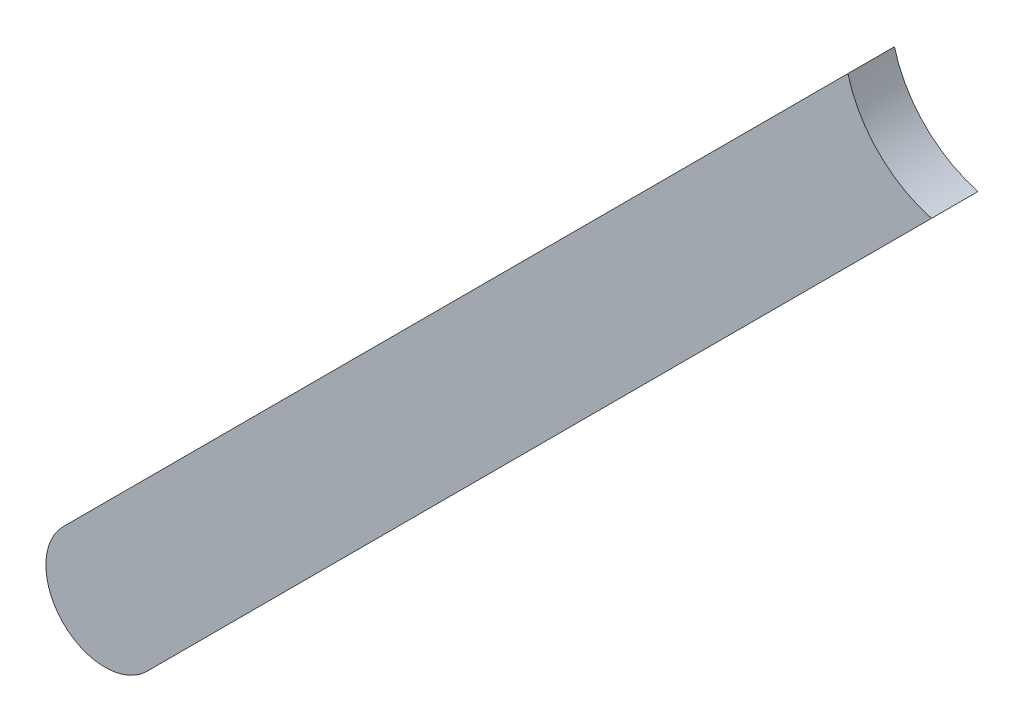
ISO-10303-21;
HEADER;
FILE_DESCRIPTION(('STEP AP214'),'2;1');
FILE_NAME('part.step','',(''),(''),'','','');
FILE_SCHEMA(('AUTOMOTIVE_DESIGN { 1 0 10303 214 1 1 1 1 }'));
ENDSEC;
DATA;
#1=APPLICATION_CONTEXT('core data for automotive mechanical design processes');
#2=APPLICATION_PROTOCOL_DEFINITION('international standard','automotive_design',2000,#1);
#3=PRODUCT_CONTEXT('',#1,'mechanical');
#4=PRODUCT('Part','Part','',(#3));
#5=PRODUCT_RELATED_PRODUCT_CATEGORY('part','',(#4));
#6=PRODUCT_DEFINITION_FORMATION('','',#4);
#7=PRODUCT_DEFINITION_CONTEXT('part definition',#1,'design');
#8=PRODUCT_DEFINITION('design','',#6,#7);
#9=PRODUCT_DEFINITION_SHAPE('','',#8);
#10=(LENGTH_UNIT() NAMED_UNIT(*) SI_UNIT(.MILLI.,.METRE.));
#11=(NAMED_UNIT(*) PLANE_ANGLE_UNIT() SI_UNIT($,.RADIAN.));
#12=(NAMED_UNIT(*) SI_UNIT($,.STERADIAN.) SOLID_ANGLE_UNIT());
#13=UNCERTAINTY_MEASURE_WITH_UNIT(LENGTH_MEASURE(1.E-05),#10,'distance_accuracy_value','');
#14=(GEOMETRIC_REPRESENTATION_CONTEXT(3) GLOBAL_UNCERTAINTY_ASSIGNED_CONTEXT((#13)) GLOBAL_UNIT_ASSIGNED_CONTEXT((#10,
#11,#12)) REPRESENTATION_CONTEXT('',''));
#15=CARTESIAN_POINT('',(0.,0.,0.));
#16=DIRECTION('',(0.,0.,1.));
#17=DIRECTION('',(1.,0.,0.));
#18=AXIS2_PLACEMENT_3D('',#15,#16,#17);
#19=CARTESIAN_POINT('',(86.66660594,90.37139406,0.));
#20=DIRECTION('',(-0.707106781186548,0.707106781186548,0.));
#21=DIRECTION('',(0.707106781186548,0.707106781186548,0.));
#22=AXIS2_PLACEMENT_3D('',#19,#20,#21);
#23=PLANE('',#22);
#24=DIRECTION('',(0.707106781186548,0.707106781186548,0.));
#25=VECTOR('',#24,1.);
#26=CARTESIAN_POINT('',(86.66660594,90.37139406,0.1999996));
#27=LINE('',#26,#25);
#28=CARTESIAN_POINT('',(86.66660594,90.37139406,0.1999996));
#29=VERTEX_POINT('',#28);
#30=CARTESIAN_POINT('',(90.0385212146972,93.7433093346972,0.1999996));
#31=VERTEX_POINT('',#30);
#32=EDGE_CURVE('E11',#29,#31,#27,.T.);
#33=ORIENTED_EDGE('',*,*,#32,.F.);
#34=DIRECTION('',(0.,0.,1.));
#35=VECTOR('',#34,1.);
#36=CARTESIAN_POINT('',(86.66660594,90.37139406,0.));
#37=LINE('',#36,#35);
#38=CARTESIAN_POINT('',(86.66660594,90.37139406,0.));
#39=VERTEX_POINT('',#38);
#40=EDGE_CURVE('E24',#39,#29,#37,.T.);
#41=ORIENTED_EDGE('',*,*,#40,.F.);
#42=DIRECTION('',(0.707106781186548,0.707106781186548,0.));
#43=VECTOR('',#42,1.);
#44=CARTESIAN_POINT('',(86.66660594,90.37139406,0.));
#45=LINE('',#44,#43);
#46=CARTESIAN_POINT('',(90.0385212146972,93.7433093346972,0.));
#47=VERTEX_POINT('',#46);
#48=EDGE_CURVE('E75',#39,#47,#45,.T.);
#49=ORIENTED_EDGE('',*,*,#48,.T.);
#50=DIRECTION('',(0.,0.,1.));
#51=VECTOR('',#50,1.);
#52=CARTESIAN_POINT('',(90.0385212146972,93.7433093346972,0.));
#53=LINE('',#52,#51);
#54=EDGE_CURVE('E37',#47,#31,#53,.T.);
#55=ORIENTED_EDGE('',*,*,#54,.T.);
#56=EDGE_LOOP('',(#33,#41,#49,#55));
#57=FACE_BOUND('',#56,.T.);
#58=ADVANCED_FACE('F17',(#57),#23,.F.);
#59=CARTESIAN_POINT('',(90.17,94.234,0.));
#60=DIRECTION('',(0.,0.,-1.));
#61=DIRECTION('',(1.,0.,0.));
#62=AXIS2_PLACEMENT_3D('',#59,#60,#61);
#63=CYLINDRICAL_SURFACE('',#62,0.508);
#64=DIRECTION('',(0.,0.,1.));
#65=VECTOR('',#64,1.);
#66=CARTESIAN_POINT('',(89.6793093346972,94.1025212146972,0.));
#67=LINE('',#66,#65);
#68=CARTESIAN_POINT('',(89.6793093346972,94.1025212146972,0.));
#69=VERTEX_POINT('',#68);
#70=CARTESIAN_POINT('',(89.6793093346972,94.1025212146972,0.1999996));
#71=VERTEX_POINT('',#70);
#72=EDGE_CURVE('E67',#69,#71,#67,.T.);
#73=ORIENTED_EDGE('',*,*,#72,.T.);
#74=CARTESIAN_POINT('',(90.17,94.234,0.1999996));
#75=DIRECTION('',(0.,0.,1.));
#76=DIRECTION('',(1.,0.,0.));
#77=AXIS2_PLACEMENT_3D('',#74,#75,#76);
#78=CIRCLE('',#77,0.508);
#79=EDGE_CURVE('E82',#71,#31,#78,.T.);
#80=ORIENTED_EDGE('',*,*,#79,.T.);
#81=ORIENTED_EDGE('',*,*,#54,.F.);
#82=CARTESIAN_POINT('',(90.17,94.234,0.));
#83=DIRECTION('',(0.,0.,1.));
#84=DIRECTION('',(1.,0.,0.));
#85=AXIS2_PLACEMENT_3D('',#82,#83,#84);
#86=CIRCLE('',#85,0.508);
#87=EDGE_CURVE('E80',#69,#47,#86,.T.);
#88=ORIENTED_EDGE('',*,*,#87,.F.);
#89=EDGE_LOOP('',(#73,#80,#81,#88));
#90=FACE_BOUND('',#89,.T.);
#91=ADVANCED_FACE('F88',(#90),#63,.F.);
#92=CARTESIAN_POINT('',(89.6793093346972,94.1025212146972,0.));
#93=DIRECTION('',(0.707106781186548,-0.707106781186548,0.));
#94=DIRECTION('',(-0.707106781186548,-0.707106781186548,0.));
#95=AXIS2_PLACEMENT_3D('',#92,#93,#94);
#96=PLANE('',#95);
#97=DIRECTION('',(-0.707106781186548,-0.707106781186548,0.));
#98=VECTOR('',#97,1.);
#99=CARTESIAN_POINT('',(89.99039406,94.41360594,0.1999996));
#100=LINE('',#99,#98);
#101=CARTESIAN_POINT('',(86.30739406,90.73060594,0.1999996));
#102=VERTEX_POINT('',#101);
#103=EDGE_CURVE('E71',#71,#102,#100,.T.);
#104=ORIENTED_EDGE('',*,*,#103,.F.);
#105=ORIENTED_EDGE('',*,*,#72,.F.);
#106=DIRECTION('',(-0.707106781186548,-0.707106781186548,0.));
#107=VECTOR('',#106,1.);
#108=CARTESIAN_POINT('',(89.99039406,94.41360594,0.));
#109=LINE('',#108,#107);
#110=CARTESIAN_POINT('',(86.30739406,90.73060594,0.));
#111=VERTEX_POINT('',#110);
#112=EDGE_CURVE('E63',#69,#111,#109,.T.);
#113=ORIENTED_EDGE('',*,*,#112,.T.);
#114=DIRECTION('',(0.,0.,1.));
#115=VECTOR('',#114,1.);
#116=CARTESIAN_POINT('',(86.30739406,90.73060594,0.));
#117=LINE('',#116,#115);
#118=EDGE_CURVE('E53',#111,#102,#117,.T.);
#119=ORIENTED_EDGE('',*,*,#118,.T.);
#120=EDGE_LOOP('',(#104,#105,#113,#119));
#121=FACE_BOUND('',#120,.T.);
#122=ADVANCED_FACE('F66',(#121),#96,.F.);
#123=CARTESIAN_POINT('',(86.487,90.551,0.));
#124=DIRECTION('',(0.,0.,-1.));
#125=DIRECTION('',(-0.707106781186548,0.707106781186548,0.));
#126=AXIS2_PLACEMENT_3D('',#123,#124,#125);
#127=CYLINDRICAL_SURFACE('',#126,0.254001156230764);
#128=CARTESIAN_POINT('',(86.487,90.551,0.1999996));
#129=DIRECTION('',(0.,0.,1.));
#130=DIRECTION('',(-0.707106781186548,0.707106781186548,0.));
#131=AXIS2_PLACEMENT_3D('',#128,#129,#130);
#132=CIRCLE('',#131,0.254001156230764);
#133=EDGE_CURVE('E59',#102,#29,#132,.T.);
#134=ORIENTED_EDGE('',*,*,#133,.F.);
#135=ORIENTED_EDGE('',*,*,#118,.F.);
#136=CARTESIAN_POINT('',(86.487,90.551,0.));
#137=DIRECTION('',(0.,0.,1.));
#138=DIRECTION('',(-0.707106781186548,0.707106781186548,0.));
#139=AXIS2_PLACEMENT_3D('',#136,#137,#138);
#140=CIRCLE('',#139,0.254001156230764);
#141=EDGE_CURVE('E57',#111,#39,#140,.T.);
#142=ORIENTED_EDGE('',*,*,#141,.T.);
#143=ORIENTED_EDGE('',*,*,#40,.T.);
#144=EDGE_LOOP('',(#134,#135,#142,#143));
#145=FACE_BOUND('',#144,.T.);
#146=ADVANCED_FACE('F55',(#145),#127,.T.);
#147=CARTESIAN_POINT('',(86.66660594,90.37139406,0.));
#148=DIRECTION('',(0.,0.,-1.));
#149=DIRECTION('',(-1.,0.,0.));
#150=AXIS2_PLACEMENT_3D('',#147,#148,#149);
#151=PLANE('',#150);
#152=ORIENTED_EDGE('',*,*,#48,.F.);
#153=ORIENTED_EDGE('',*,*,#141,.F.);
#154=ORIENTED_EDGE('',*,*,#112,.F.);
#155=ORIENTED_EDGE('',*,*,#87,.T.);
#156=EDGE_LOOP('',(#152,#153,#154,#155));
#157=FACE_BOUND('',#156,.T.);
#158=ADVANCED_FACE('F74',(#157),#151,.T.);
#159=CARTESIAN_POINT('',(86.66660594,90.37139406,0.1999996));
#160=DIRECTION('',(0.,0.,-1.));
#161=DIRECTION('',(-1.,0.,0.));
#162=AXIS2_PLACEMENT_3D('',#159,#160,#161);
#163=PLANE('',#162);
#164=ORIENTED_EDGE('',*,*,#133,.T.);
#165=ORIENTED_EDGE('',*,*,#32,.T.);
#166=ORIENTED_EDGE('',*,*,#79,.F.);
#167=ORIENTED_EDGE('',*,*,#103,.T.);
#168=EDGE_LOOP('',(#164,#165,#166,#167));
#169=FACE_BOUND('',#168,.T.);
#170=ADVANCED_FACE('F91',(#169),#163,.F.);
#171=CLOSED_SHELL('',(#58,#91,#122,#146,#158,#170));
#172=MANIFOLD_SOLID_BREP('B1',#171);
#173=ADVANCED_BREP_SHAPE_REPRESENTATION('',(#18,#172),#14);
#174=SHAPE_DEFINITION_REPRESENTATION(#9,#173);
ENDSEC;
END-ISO-10303-21;
